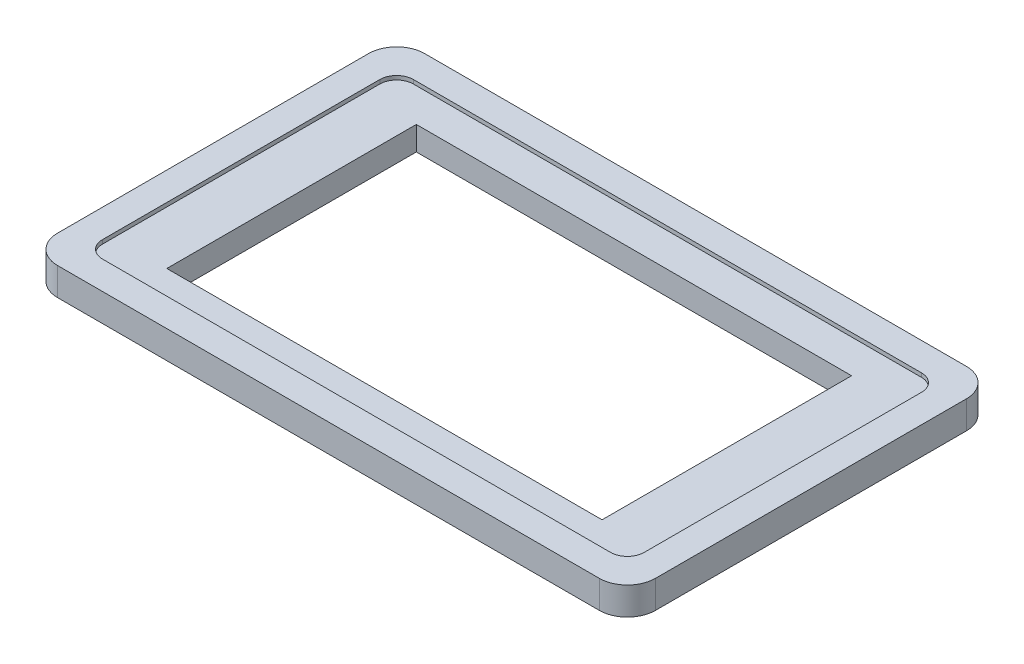
ISO-10303-21;
HEADER;
FILE_DESCRIPTION(('STEP AP214'),'2;1');
FILE_NAME('part.step','',(''),(''),'','','');
FILE_SCHEMA(('AUTOMOTIVE_DESIGN { 1 0 10303 214 1 1 1 1 }'));
ENDSEC;
DATA;
#1=APPLICATION_CONTEXT('core data for automotive mechanical design processes');
#2=APPLICATION_PROTOCOL_DEFINITION('international standard','automotive_design',2000,#1);
#3=PRODUCT_CONTEXT('',#1,'mechanical');
#4=PRODUCT('Part','Part','',(#3));
#5=PRODUCT_RELATED_PRODUCT_CATEGORY('part','',(#4));
#6=PRODUCT_DEFINITION_FORMATION('','',#4);
#7=PRODUCT_DEFINITION_CONTEXT('part definition',#1,'design');
#8=PRODUCT_DEFINITION('design','',#6,#7);
#9=PRODUCT_DEFINITION_SHAPE('','',#8);
#10=(LENGTH_UNIT() NAMED_UNIT(*) SI_UNIT(.MILLI.,.METRE.));
#11=(NAMED_UNIT(*) PLANE_ANGLE_UNIT() SI_UNIT($,.RADIAN.));
#12=(NAMED_UNIT(*) SI_UNIT($,.STERADIAN.) SOLID_ANGLE_UNIT());
#13=UNCERTAINTY_MEASURE_WITH_UNIT(LENGTH_MEASURE(1.E-05),#10,'distance_accuracy_value','');
#14=(GEOMETRIC_REPRESENTATION_CONTEXT(3) GLOBAL_UNCERTAINTY_ASSIGNED_CONTEXT((#13)) GLOBAL_UNIT_ASSIGNED_CONTEXT((#10,
#11,#12)) REPRESENTATION_CONTEXT('',''));
#15=CARTESIAN_POINT('',(0.,0.,0.));
#16=DIRECTION('',(0.,0.,1.));
#17=DIRECTION('',(1.,0.,0.));
#18=AXIS2_PLACEMENT_3D('',#15,#16,#17);
#19=CARTESIAN_POINT('',(10.,1.4,0.));
#20=DIRECTION('',(-1.,0.,0.));
#21=DIRECTION('',(0.,0.,1.));
#22=AXIS2_PLACEMENT_3D('',#19,#20,#21);
#23=PLANE('',#22);
#24=DIRECTION('',(0.,0.,-1.));
#25=VECTOR('',#24,1.);
#26=CARTESIAN_POINT('',(10.,0.,0.));
#27=LINE('',#26,#25);
#28=CARTESIAN_POINT('',(10.,0.,-16.));
#29=VERTEX_POINT('',#28);
#30=CARTESIAN_POINT('',(10.,0.,-114.76));
#31=VERTEX_POINT('',#30);
#32=EDGE_CURVE('E260',#29,#31,#27,.T.);
#33=ORIENTED_EDGE('',*,*,#32,.T.);
#34=DIRECTION('',(0.,-1.,0.));
#35=VECTOR('',#34,1.);
#36=CARTESIAN_POINT('',(10.,1.4,-114.76));
#37=LINE('',#36,#35);
#38=CARTESIAN_POINT('',(10.,1.4,-114.76));
#39=VERTEX_POINT('',#38);
#40=EDGE_CURVE('E11',#39,#31,#37,.T.);
#41=ORIENTED_EDGE('',*,*,#40,.F.);
#42=DIRECTION('',(0.,0.,-1.));
#43=VECTOR('',#42,1.);
#44=CARTESIAN_POINT('',(10.,1.4,0.));
#45=LINE('',#44,#43);
#46=CARTESIAN_POINT('',(10.,1.4,-16.));
#47=VERTEX_POINT('',#46);
#48=EDGE_CURVE('E296',#47,#39,#45,.T.);
#49=ORIENTED_EDGE('',*,*,#48,.F.);
#50=DIRECTION('',(0.,-1.,0.));
#51=VECTOR('',#50,1.);
#52=CARTESIAN_POINT('',(10.,1.4,-16.));
#53=LINE('',#52,#51);
#54=EDGE_CURVE('E350',#47,#29,#53,.T.);
#55=ORIENTED_EDGE('',*,*,#54,.T.);
#56=EDGE_LOOP('',(#33,#41,#49,#55));
#57=FACE_BOUND('',#56,.T.);
#58=ADVANCED_FACE('F41',(#57),#23,.F.);
#59=CARTESIAN_POINT('',(16.,1.4,-114.76));
#60=DIRECTION('',(0.,-1.,0.));
#61=DIRECTION('',(0.,0.,-1.));
#62=AXIS2_PLACEMENT_3D('',#59,#60,#61);
#63=CYLINDRICAL_SURFACE('',#62,6.);
#64=CARTESIAN_POINT('',(16.,0.,-114.76));
#65=DIRECTION('',(0.,1.,0.));
#66=DIRECTION('',(0.,0.,1.));
#67=AXIS2_PLACEMENT_3D('',#64,#65,#66);
#68=CIRCLE('',#67,6.);
#69=CARTESIAN_POINT('',(16.,0.,-120.76));
#70=VERTEX_POINT('',#69);
#71=EDGE_CURVE('E326',#31,#70,#68,.F.);
#72=ORIENTED_EDGE('',*,*,#71,.T.);
#73=DIRECTION('',(0.,-1.,0.));
#74=VECTOR('',#73,1.);
#75=CARTESIAN_POINT('',(16.,1.4,-120.76));
#76=LINE('',#75,#74);
#77=CARTESIAN_POINT('',(16.,1.4,-120.76));
#78=VERTEX_POINT('',#77);
#79=EDGE_CURVE('E52',#78,#70,#76,.T.);
#80=ORIENTED_EDGE('',*,*,#79,.F.);
#81=CARTESIAN_POINT('',(16.,1.4,-114.76));
#82=DIRECTION('',(0.,1.,0.));
#83=DIRECTION('',(0.,0.,1.));
#84=AXIS2_PLACEMENT_3D('',#81,#82,#83);
#85=CIRCLE('',#84,6.);
#86=EDGE_CURVE('E299',#39,#78,#85,.F.);
#87=ORIENTED_EDGE('',*,*,#86,.F.);
#88=ORIENTED_EDGE('',*,*,#40,.T.);
#89=EDGE_LOOP('',(#72,#80,#87,#88));
#90=FACE_BOUND('',#89,.T.);
#91=ADVANCED_FACE('F438',(#90),#63,.F.);
#92=CARTESIAN_POINT('',(0.,1.4,-120.76));
#93=DIRECTION('',(0.,0.,-1.));
#94=DIRECTION('',(-1.,0.,0.));
#95=AXIS2_PLACEMENT_3D('',#92,#93,#94);
#96=PLANE('',#95);
#97=DIRECTION('',(1.,0.,0.));
#98=VECTOR('',#97,1.);
#99=CARTESIAN_POINT('',(0.,0.,-120.76));
#100=LINE('',#99,#98);
#101=CARTESIAN_POINT('',(196.96,0.,-120.76));
#102=VERTEX_POINT('',#101);
#103=EDGE_CURVE('E330',#70,#102,#100,.T.);
#104=ORIENTED_EDGE('',*,*,#103,.T.);
#105=DIRECTION('',(0.,-1.,0.));
#106=VECTOR('',#105,1.);
#107=CARTESIAN_POINT('',(196.96,1.4,-120.76));
#108=LINE('',#107,#106);
#109=CARTESIAN_POINT('',(196.96,1.4,-120.76));
#110=VERTEX_POINT('',#109);
#111=EDGE_CURVE('E370',#110,#102,#108,.T.);
#112=ORIENTED_EDGE('',*,*,#111,.F.);
#113=DIRECTION('',(1.,0.,0.));
#114=VECTOR('',#113,1.);
#115=CARTESIAN_POINT('',(0.,1.4,-120.76));
#116=LINE('',#115,#114);
#117=EDGE_CURVE('E302',#78,#110,#116,.T.);
#118=ORIENTED_EDGE('',*,*,#117,.F.);
#119=ORIENTED_EDGE('',*,*,#79,.T.);
#120=EDGE_LOOP('',(#104,#112,#118,#119));
#121=FACE_BOUND('',#120,.T.);
#122=ADVANCED_FACE('F444',(#121),#96,.F.);
#123=CARTESIAN_POINT('',(196.96,1.4,-114.76));
#124=DIRECTION('',(0.,-1.,0.));
#125=DIRECTION('',(0.,0.,-1.));
#126=AXIS2_PLACEMENT_3D('',#123,#124,#125);
#127=CYLINDRICAL_SURFACE('',#126,6.00000000000001);
#128=CARTESIAN_POINT('',(196.96,0.,-114.76));
#129=DIRECTION('',(0.,1.,0.));
#130=DIRECTION('',(0.,0.,1.));
#131=AXIS2_PLACEMENT_3D('',#128,#129,#130);
#132=CIRCLE('',#131,6.00000000000001);
#133=CARTESIAN_POINT('',(202.96,0.,-114.76));
#134=VERTEX_POINT('',#133);
#135=EDGE_CURVE('E334',#102,#134,#132,.F.);
#136=ORIENTED_EDGE('',*,*,#135,.T.);
#137=DIRECTION('',(0.,-1.,0.));
#138=VECTOR('',#137,1.);
#139=CARTESIAN_POINT('',(202.96,1.4,-114.76));
#140=LINE('',#139,#138);
#141=CARTESIAN_POINT('',(202.96,1.4,-114.76));
#142=VERTEX_POINT('',#141);
#143=EDGE_CURVE('E366',#142,#134,#140,.T.);
#144=ORIENTED_EDGE('',*,*,#143,.F.);
#145=CARTESIAN_POINT('',(196.96,1.4,-114.76));
#146=DIRECTION('',(0.,1.,0.));
#147=DIRECTION('',(0.,0.,1.));
#148=AXIS2_PLACEMENT_3D('',#145,#146,#147);
#149=CIRCLE('',#148,6.00000000000001);
#150=EDGE_CURVE('E305',#110,#142,#149,.F.);
#151=ORIENTED_EDGE('',*,*,#150,.F.);
#152=ORIENTED_EDGE('',*,*,#111,.T.);
#153=EDGE_LOOP('',(#136,#144,#151,#152));
#154=FACE_BOUND('',#153,.T.);
#155=ADVANCED_FACE('F638',(#154),#127,.F.);
#156=CARTESIAN_POINT('',(202.96,1.4,0.));
#157=DIRECTION('',(-1.,0.,0.));
#158=DIRECTION('',(0.,0.,1.));
#159=AXIS2_PLACEMENT_3D('',#156,#157,#158);
#160=PLANE('',#159);
#161=DIRECTION('',(0.,0.,-1.));
#162=VECTOR('',#161,1.);
#163=CARTESIAN_POINT('',(202.96,0.,0.));
#164=LINE('',#163,#162);
#165=CARTESIAN_POINT('',(202.96,0.,-16.));
#166=VERTEX_POINT('',#165);
#167=EDGE_CURVE('E338',#166,#134,#164,.T.);
#168=ORIENTED_EDGE('',*,*,#167,.F.);
#169=DIRECTION('',(0.,-1.,0.));
#170=VECTOR('',#169,1.);
#171=CARTESIAN_POINT('',(202.96,1.4,-16.));
#172=LINE('',#171,#170);
#173=CARTESIAN_POINT('',(202.96,1.4,-16.));
#174=VERTEX_POINT('',#173);
#175=EDGE_CURVE('E362',#174,#166,#172,.T.);
#176=ORIENTED_EDGE('',*,*,#175,.F.);
#177=DIRECTION('',(0.,0.,-1.));
#178=VECTOR('',#177,1.);
#179=CARTESIAN_POINT('',(202.96,1.4,0.));
#180=LINE('',#179,#178);
#181=EDGE_CURVE('E308',#174,#142,#180,.T.);
#182=ORIENTED_EDGE('',*,*,#181,.T.);
#183=ORIENTED_EDGE('',*,*,#143,.T.);
#184=EDGE_LOOP('',(#168,#176,#182,#183));
#185=FACE_BOUND('',#184,.T.);
#186=ADVANCED_FACE('F628',(#185),#160,.T.);
#187=CARTESIAN_POINT('',(196.96,1.4,-16.));
#188=DIRECTION('',(0.,-1.,0.));
#189=DIRECTION('',(0.,0.,-1.));
#190=AXIS2_PLACEMENT_3D('',#187,#188,#189);
#191=CYLINDRICAL_SURFACE('',#190,6.);
#192=CARTESIAN_POINT('',(196.96,0.,-16.));
#193=DIRECTION('',(0.,1.,0.));
#194=DIRECTION('',(0.,0.,1.));
#195=AXIS2_PLACEMENT_3D('',#192,#193,#194);
#196=CIRCLE('',#195,6.);
#197=CARTESIAN_POINT('',(196.96,0.,-10.));
#198=VERTEX_POINT('',#197);
#199=EDGE_CURVE('E341',#198,#166,#196,.T.);
#200=ORIENTED_EDGE('',*,*,#199,.F.);
#201=DIRECTION('',(0.,-1.,0.));
#202=VECTOR('',#201,1.);
#203=CARTESIAN_POINT('',(196.96,1.4,-10.));
#204=LINE('',#203,#202);
#205=CARTESIAN_POINT('',(196.96,1.4,-10.));
#206=VERTEX_POINT('',#205);
#207=EDGE_CURVE('E358',#206,#198,#204,.T.);
#208=ORIENTED_EDGE('',*,*,#207,.F.);
#209=CARTESIAN_POINT('',(196.96,1.4,-16.));
#210=DIRECTION('',(0.,1.,0.));
#211=DIRECTION('',(0.,0.,1.));
#212=AXIS2_PLACEMENT_3D('',#209,#210,#211);
#213=CIRCLE('',#212,6.);
#214=EDGE_CURVE('E312',#206,#174,#213,.T.);
#215=ORIENTED_EDGE('',*,*,#214,.T.);
#216=ORIENTED_EDGE('',*,*,#175,.T.);
#217=EDGE_LOOP('',(#200,#208,#215,#216));
#218=FACE_BOUND('',#217,.T.);
#219=ADVANCED_FACE('F618',(#218),#191,.F.);
#220=CARTESIAN_POINT('',(0.,1.4,-10.));
#221=DIRECTION('',(0.,0.,-1.));
#222=DIRECTION('',(-1.,0.,0.));
#223=AXIS2_PLACEMENT_3D('',#220,#221,#222);
#224=PLANE('',#223);
#225=DIRECTION('',(1.,0.,0.));
#226=VECTOR('',#225,1.);
#227=CARTESIAN_POINT('',(0.,0.,-10.));
#228=LINE('',#227,#226);
#229=CARTESIAN_POINT('',(16.,0.,-10.));
#230=VERTEX_POINT('',#229);
#231=EDGE_CURVE('E344',#230,#198,#228,.T.);
#232=ORIENTED_EDGE('',*,*,#231,.F.);
#233=DIRECTION('',(0.,-1.,0.));
#234=VECTOR('',#233,1.);
#235=CARTESIAN_POINT('',(16.,1.4,-10.));
#236=LINE('',#235,#234);
#237=CARTESIAN_POINT('',(16.,1.4,-10.));
#238=VERTEX_POINT('',#237);
#239=EDGE_CURVE('E354',#238,#230,#236,.T.);
#240=ORIENTED_EDGE('',*,*,#239,.F.);
#241=DIRECTION('',(1.,0.,0.));
#242=VECTOR('',#241,1.);
#243=CARTESIAN_POINT('',(0.,1.4,-10.));
#244=LINE('',#243,#242);
#245=EDGE_CURVE('E316',#238,#206,#244,.T.);
#246=ORIENTED_EDGE('',*,*,#245,.T.);
#247=ORIENTED_EDGE('',*,*,#207,.T.);
#248=EDGE_LOOP('',(#232,#240,#246,#247));
#249=FACE_BOUND('',#248,.T.);
#250=ADVANCED_FACE('F604',(#249),#224,.T.);
#251=CARTESIAN_POINT('',(10.,1.4,-120.76));
#252=DIRECTION('',(0.,-1.,0.));
#253=DIRECTION('',(0.,0.,-1.));
#254=AXIS2_PLACEMENT_3D('',#251,#252,#253);
#255=CYLINDRICAL_SURFACE('',#254,10.);
#256=DIRECTION('',(0.,-1.,0.));
#257=VECTOR('',#256,1.);
#258=CARTESIAN_POINT('',(10.0000000000001,1.4,-130.76));
#259=LINE('',#258,#257);
#260=CARTESIAN_POINT('',(10.0000000000001,1.4,-130.76));
#261=VERTEX_POINT('',#260);
#262=CARTESIAN_POINT('',(10.0000000000001,-8.5,-130.76));
#263=VERTEX_POINT('',#262);
#264=EDGE_CURVE('E322',#261,#263,#259,.T.);
#265=ORIENTED_EDGE('',*,*,#264,.T.);
#266=CARTESIAN_POINT('',(10.,-8.5,-120.76));
#267=DIRECTION('',(0.,1.,0.));
#268=DIRECTION('',(0.,0.,1.));
#269=AXIS2_PLACEMENT_3D('',#266,#267,#268);
#270=CIRCLE('',#269,10.);
#271=CARTESIAN_POINT('',(0.,-8.5,-120.76));
#272=VERTEX_POINT('',#271);
#273=EDGE_CURVE('E220',#272,#263,#270,.F.);
#274=ORIENTED_EDGE('',*,*,#273,.F.);
#275=DIRECTION('',(0.,-1.,0.));
#276=VECTOR('',#275,1.);
#277=CARTESIAN_POINT('',(0.,1.4,-120.76));
#278=LINE('',#277,#276);
#279=CARTESIAN_POINT('',(0.,1.4,-120.76));
#280=VERTEX_POINT('',#279);
#281=EDGE_CURVE('E45',#280,#272,#278,.T.);
#282=ORIENTED_EDGE('',*,*,#281,.F.);
#283=CARTESIAN_POINT('',(10.,1.4,-120.76));
#284=DIRECTION('',(0.,1.,0.));
#285=DIRECTION('',(0.,0.,1.));
#286=AXIS2_PLACEMENT_3D('',#283,#284,#285);
#287=CIRCLE('',#286,10.);
#288=EDGE_CURVE('E266',#280,#261,#287,.F.);
#289=ORIENTED_EDGE('',*,*,#288,.T.);
#290=EDGE_LOOP('',(#265,#274,#282,#289));
#291=FACE_BOUND('',#290,.T.);
#292=ADVANCED_FACE('F43',(#291),#255,.T.);
#293=CARTESIAN_POINT('',(0.,1.4,0.));
#294=DIRECTION('',(-1.,0.,0.));
#295=DIRECTION('',(0.,0.,1.));
#296=AXIS2_PLACEMENT_3D('',#293,#294,#295);
#297=PLANE('',#296);
#298=ORIENTED_EDGE('',*,*,#281,.T.);
#299=DIRECTION('',(0.,0.,-1.));
#300=VECTOR('',#299,1.);
#301=CARTESIAN_POINT('',(0.,-8.5,0.));
#302=LINE('',#301,#300);
#303=CARTESIAN_POINT('',(0.,-8.5,-10.0000000000001));
#304=VERTEX_POINT('',#303);
#305=EDGE_CURVE('E224',#304,#272,#302,.T.);
#306=ORIENTED_EDGE('',*,*,#305,.F.);
#307=DIRECTION('',(0.,-1.,0.));
#308=VECTOR('',#307,1.);
#309=CARTESIAN_POINT('',(0.,1.4,-10.0000000000001));
#310=LINE('',#309,#308);
#311=CARTESIAN_POINT('',(0.,1.4,-10.0000000000001));
#312=VERTEX_POINT('',#311);
#313=EDGE_CURVE('E393',#312,#304,#310,.T.);
#314=ORIENTED_EDGE('',*,*,#313,.F.);
#315=DIRECTION('',(0.,0.,-1.));
#316=VECTOR('',#315,1.);
#317=CARTESIAN_POINT('',(0.,1.4,0.));
#318=LINE('',#317,#316);
#319=EDGE_CURVE('E270',#312,#280,#318,.T.);
#320=ORIENTED_EDGE('',*,*,#319,.T.);
#321=EDGE_LOOP('',(#298,#306,#314,#320));
#322=FACE_BOUND('',#321,.T.);
#323=ADVANCED_FACE('F400',(#322),#297,.T.);
#324=CARTESIAN_POINT('',(10.,1.4,-10.));
#325=DIRECTION('',(0.,-1.,0.));
#326=DIRECTION('',(0.,0.,-1.));
#327=AXIS2_PLACEMENT_3D('',#324,#325,#326);
#328=CYLINDRICAL_SURFACE('',#327,10.);
#329=ORIENTED_EDGE('',*,*,#313,.T.);
#330=CARTESIAN_POINT('',(10.,-8.5,-10.));
#331=DIRECTION('',(0.,1.,0.));
#332=DIRECTION('',(0.,0.,1.));
#333=AXIS2_PLACEMENT_3D('',#330,#331,#332);
#334=CIRCLE('',#333,10.);
#335=CARTESIAN_POINT('',(10.0000000000001,-8.5,0.));
#336=VERTEX_POINT('',#335);
#337=EDGE_CURVE('E228',#336,#304,#334,.F.);
#338=ORIENTED_EDGE('',*,*,#337,.F.);
#339=DIRECTION('',(0.,-1.,0.));
#340=VECTOR('',#339,1.);
#341=CARTESIAN_POINT('',(10.0000000000001,1.4,0.));
#342=LINE('',#341,#340);
#343=CARTESIAN_POINT('',(10.0000000000001,1.4,0.));
#344=VERTEX_POINT('',#343);
#345=EDGE_CURVE('E391',#344,#336,#342,.T.);
#346=ORIENTED_EDGE('',*,*,#345,.F.);
#347=CARTESIAN_POINT('',(10.,1.4,-10.));
#348=DIRECTION('',(0.,1.,0.));
#349=DIRECTION('',(0.,0.,1.));
#350=AXIS2_PLACEMENT_3D('',#347,#348,#349);
#351=CIRCLE('',#350,10.);
#352=EDGE_CURVE('E275',#344,#312,#351,.F.);
#353=ORIENTED_EDGE('',*,*,#352,.T.);
#354=EDGE_LOOP('',(#329,#338,#346,#353));
#355=FACE_BOUND('',#354,.T.);
#356=ADVANCED_FACE('F429',(#355),#328,.T.);
#357=CARTESIAN_POINT('',(0.,1.4,0.));
#358=DIRECTION('',(0.,0.,-1.));
#359=DIRECTION('',(-1.,0.,0.));
#360=AXIS2_PLACEMENT_3D('',#357,#358,#359);
#361=PLANE('',#360);
#362=ORIENTED_EDGE('',*,*,#345,.T.);
#363=DIRECTION('',(1.,0.,0.));
#364=VECTOR('',#363,1.);
#365=CARTESIAN_POINT('',(0.,-8.5,0.));
#366=LINE('',#365,#364);
#367=CARTESIAN_POINT('',(202.96,-8.5,0.));
#368=VERTEX_POINT('',#367);
#369=EDGE_CURVE('E232',#336,#368,#366,.T.);
#370=ORIENTED_EDGE('',*,*,#369,.T.);
#371=DIRECTION('',(0.,-1.,0.));
#372=VECTOR('',#371,1.);
#373=CARTESIAN_POINT('',(202.96,1.4,0.));
#374=LINE('',#373,#372);
#375=CARTESIAN_POINT('',(202.96,1.4,0.));
#376=VERTEX_POINT('',#375);
#377=EDGE_CURVE('E388',#376,#368,#374,.T.);
#378=ORIENTED_EDGE('',*,*,#377,.F.);
#379=DIRECTION('',(1.,0.,0.));
#380=VECTOR('',#379,1.);
#381=CARTESIAN_POINT('',(0.,1.4,0.));
#382=LINE('',#381,#380);
#383=EDGE_CURVE('E279',#344,#376,#382,.T.);
#384=ORIENTED_EDGE('',*,*,#383,.F.);
#385=EDGE_LOOP('',(#362,#370,#378,#384));
#386=FACE_BOUND('',#385,.T.);
#387=ADVANCED_FACE('F427',(#386),#361,.F.);
#388=CARTESIAN_POINT('',(202.96,1.4,-10.));
#389=DIRECTION('',(0.,-1.,0.));
#390=DIRECTION('',(0.,0.,-1.));
#391=AXIS2_PLACEMENT_3D('',#388,#389,#390);
#392=CYLINDRICAL_SURFACE('',#391,10.);
#393=ORIENTED_EDGE('',*,*,#377,.T.);
#394=CARTESIAN_POINT('',(202.96,-8.5,-10.));
#395=DIRECTION('',(0.,1.,0.));
#396=DIRECTION('',(0.,0.,1.));
#397=AXIS2_PLACEMENT_3D('',#394,#395,#396);
#398=CIRCLE('',#397,10.);
#399=CARTESIAN_POINT('',(212.96,-8.5,-10.0000000000001));
#400=VERTEX_POINT('',#399);
#401=EDGE_CURVE('E236',#368,#400,#398,.T.);
#402=ORIENTED_EDGE('',*,*,#401,.T.);
#403=DIRECTION('',(0.,-1.,0.));
#404=VECTOR('',#403,1.);
#405=CARTESIAN_POINT('',(212.96,1.4,-10.0000000000001));
#406=LINE('',#405,#404);
#407=CARTESIAN_POINT('',(212.96,1.4,-10.0000000000001));
#408=VERTEX_POINT('',#407);
#409=EDGE_CURVE('E385',#408,#400,#406,.T.);
#410=ORIENTED_EDGE('',*,*,#409,.F.);
#411=CARTESIAN_POINT('',(202.96,1.4,-10.));
#412=DIRECTION('',(0.,1.,0.));
#413=DIRECTION('',(0.,0.,1.));
#414=AXIS2_PLACEMENT_3D('',#411,#412,#413);
#415=CIRCLE('',#414,10.);
#416=EDGE_CURVE('E282',#376,#408,#415,.T.);
#417=ORIENTED_EDGE('',*,*,#416,.F.);
#418=EDGE_LOOP('',(#393,#402,#410,#417));
#419=FACE_BOUND('',#418,.T.);
#420=ADVANCED_FACE('F422',(#419),#392,.T.);
#421=CARTESIAN_POINT('',(212.96,1.4,0.));
#422=DIRECTION('',(-1.,0.,0.));
#423=DIRECTION('',(0.,0.,1.));
#424=AXIS2_PLACEMENT_3D('',#421,#422,#423);
#425=PLANE('',#424);
#426=ORIENTED_EDGE('',*,*,#409,.T.);
#427=DIRECTION('',(0.,0.,-1.));
#428=VECTOR('',#427,1.);
#429=CARTESIAN_POINT('',(212.96,-8.5,0.));
#430=LINE('',#429,#428);
#431=CARTESIAN_POINT('',(212.96,-8.5,-120.76));
#432=VERTEX_POINT('',#431);
#433=EDGE_CURVE('E240',#400,#432,#430,.T.);
#434=ORIENTED_EDGE('',*,*,#433,.T.);
#435=DIRECTION('',(0.,-1.,0.));
#436=VECTOR('',#435,1.);
#437=CARTESIAN_POINT('',(212.96,1.4,-120.76));
#438=LINE('',#437,#436);
#439=CARTESIAN_POINT('',(212.96,1.4,-120.76));
#440=VERTEX_POINT('',#439);
#441=EDGE_CURVE('E382',#440,#432,#438,.T.);
#442=ORIENTED_EDGE('',*,*,#441,.F.);
#443=DIRECTION('',(0.,0.,-1.));
#444=VECTOR('',#443,1.);
#445=CARTESIAN_POINT('',(212.96,1.4,0.));
#446=LINE('',#445,#444);
#447=EDGE_CURVE('E285',#408,#440,#446,.T.);
#448=ORIENTED_EDGE('',*,*,#447,.F.);
#449=EDGE_LOOP('',(#426,#434,#442,#448));
#450=FACE_BOUND('',#449,.T.);
#451=ADVANCED_FACE('F418',(#450),#425,.F.);
#452=CARTESIAN_POINT('',(202.96,1.4,-120.76));
#453=DIRECTION('',(0.,-1.,0.));
#454=DIRECTION('',(0.,0.,-1.));
#455=AXIS2_PLACEMENT_3D('',#452,#453,#454);
#456=CYLINDRICAL_SURFACE('',#455,10.);
#457=ORIENTED_EDGE('',*,*,#441,.T.);
#458=CARTESIAN_POINT('',(202.96,-8.5,-120.76));
#459=DIRECTION('',(0.,1.,0.));
#460=DIRECTION('',(0.,0.,1.));
#461=AXIS2_PLACEMENT_3D('',#458,#459,#460);
#462=CIRCLE('',#461,10.);
#463=CARTESIAN_POINT('',(202.96,-8.5,-130.76));
#464=VERTEX_POINT('',#463);
#465=EDGE_CURVE('E244',#464,#432,#462,.F.);
#466=ORIENTED_EDGE('',*,*,#465,.F.);
#467=DIRECTION('',(0.,-1.,0.));
#468=VECTOR('',#467,1.);
#469=CARTESIAN_POINT('',(202.96,1.4,-130.76));
#470=LINE('',#469,#468);
#471=CARTESIAN_POINT('',(202.96,1.4,-130.76));
#472=VERTEX_POINT('',#471);
#473=EDGE_CURVE('E379',#472,#464,#470,.T.);
#474=ORIENTED_EDGE('',*,*,#473,.F.);
#475=CARTESIAN_POINT('',(202.96,1.4,-120.76));
#476=DIRECTION('',(0.,1.,0.));
#477=DIRECTION('',(0.,0.,1.));
#478=AXIS2_PLACEMENT_3D('',#475,#476,#477);
#479=CIRCLE('',#478,10.);
#480=EDGE_CURVE('E288',#472,#440,#479,.F.);
#481=ORIENTED_EDGE('',*,*,#480,.T.);
#482=EDGE_LOOP('',(#457,#466,#474,#481));
#483=FACE_BOUND('',#482,.T.);
#484=ADVANCED_FACE('F413',(#483),#456,.T.);
#485=CARTESIAN_POINT('',(0.,1.4,-130.76));
#486=DIRECTION('',(0.,0.,-1.));
#487=DIRECTION('',(-1.,0.,0.));
#488=AXIS2_PLACEMENT_3D('',#485,#486,#487);
#489=PLANE('',#488);
#490=ORIENTED_EDGE('',*,*,#473,.T.);
#491=DIRECTION('',(1.,0.,0.));
#492=VECTOR('',#491,1.);
#493=CARTESIAN_POINT('',(0.,-8.5,-130.76));
#494=LINE('',#493,#492);
#495=EDGE_CURVE('E203',#263,#464,#494,.T.);
#496=ORIENTED_EDGE('',*,*,#495,.F.);
#497=ORIENTED_EDGE('',*,*,#264,.F.);
#498=DIRECTION('',(1.,0.,0.));
#499=VECTOR('',#498,1.);
#500=CARTESIAN_POINT('',(0.,1.4,-130.76));
#501=LINE('',#500,#499);
#502=EDGE_CURVE('E292',#261,#472,#501,.T.);
#503=ORIENTED_EDGE('',*,*,#502,.T.);
#504=EDGE_LOOP('',(#490,#496,#497,#503));
#505=FACE_BOUND('',#504,.T.);
#506=ADVANCED_FACE('F409',(#505),#489,.T.);
#507=CARTESIAN_POINT('',(16.,1.4,-16.));
#508=DIRECTION('',(0.,-1.,0.));
#509=DIRECTION('',(0.,0.,-1.));
#510=AXIS2_PLACEMENT_3D('',#507,#508,#509);
#511=CYLINDRICAL_SURFACE('',#510,6.);
#512=CARTESIAN_POINT('',(16.,0.,-16.));
#513=DIRECTION('',(0.,1.,0.));
#514=DIRECTION('',(0.,0.,1.));
#515=AXIS2_PLACEMENT_3D('',#512,#513,#514);
#516=CIRCLE('',#515,6.);
#517=EDGE_CURVE('E271',#230,#29,#516,.F.);
#518=ORIENTED_EDGE('',*,*,#517,.T.);
#519=ORIENTED_EDGE('',*,*,#54,.F.);
#520=CARTESIAN_POINT('',(16.,1.4,-16.));
#521=DIRECTION('',(0.,1.,0.));
#522=DIRECTION('',(0.,0.,1.));
#523=AXIS2_PLACEMENT_3D('',#520,#521,#522);
#524=CIRCLE('',#523,6.);
#525=EDGE_CURVE('E60',#238,#47,#524,.F.);
#526=ORIENTED_EDGE('',*,*,#525,.F.);
#527=ORIENTED_EDGE('',*,*,#239,.T.);
#528=EDGE_LOOP('',(#518,#519,#526,#527));
#529=FACE_BOUND('',#528,.T.);
#530=ADVANCED_FACE('F451',(#529),#511,.F.);
#531=CARTESIAN_POINT('',(0.,1.4,0.));
#532=DIRECTION('',(0.,1.,0.));
#533=DIRECTION('',(0.,0.,1.));
#534=AXIS2_PLACEMENT_3D('',#531,#532,#533);
#535=PLANE('',#534);
#536=ORIENTED_EDGE('',*,*,#288,.F.);
#537=ORIENTED_EDGE('',*,*,#319,.F.);
#538=ORIENTED_EDGE('',*,*,#352,.F.);
#539=ORIENTED_EDGE('',*,*,#383,.T.);
#540=ORIENTED_EDGE('',*,*,#416,.T.);
#541=ORIENTED_EDGE('',*,*,#447,.T.);
#542=ORIENTED_EDGE('',*,*,#480,.F.);
#543=ORIENTED_EDGE('',*,*,#502,.F.);
#544=EDGE_LOOP('',(#536,#537,#538,#539,#540,#541,#542,#543));
#545=FACE_BOUND('',#544,.T.);
#546=ORIENTED_EDGE('',*,*,#48,.T.);
#547=ORIENTED_EDGE('',*,*,#86,.T.);
#548=ORIENTED_EDGE('',*,*,#117,.T.);
#549=ORIENTED_EDGE('',*,*,#150,.T.);
#550=ORIENTED_EDGE('',*,*,#181,.F.);
#551=ORIENTED_EDGE('',*,*,#214,.F.);
#552=ORIENTED_EDGE('',*,*,#245,.F.);
#553=ORIENTED_EDGE('',*,*,#525,.T.);
#554=EDGE_LOOP('',(#546,#547,#548,#549,#550,#551,#552,#553));
#555=FACE_BOUND('',#554,.T.);
#556=ADVANCED_FACE('F479',(#545,#555),#535,.T.);
#557=CARTESIAN_POINT('',(0.,0.,0.));
#558=DIRECTION('',(0.,1.,0.));
#559=DIRECTION('',(0.,0.,1.));
#560=AXIS2_PLACEMENT_3D('',#557,#558,#559);
#561=PLANE('',#560);
#562=DIRECTION('',(0.,0.,1.));
#563=VECTOR('',#562,1.);
#564=CARTESIAN_POINT('',(183.995,0.,0.));
#565=LINE('',#564,#563);
#566=CARTESIAN_POINT('',(183.995,0.,-108.815));
#567=VERTEX_POINT('',#566);
#568=CARTESIAN_POINT('',(183.995,0.,-19.9450000000001));
#569=VERTEX_POINT('',#568);
#570=EDGE_CURVE('E251',#567,#569,#565,.T.);
#571=ORIENTED_EDGE('',*,*,#570,.T.);
#572=DIRECTION('',(1.,0.,0.));
#573=VECTOR('',#572,1.);
#574=CARTESIAN_POINT('',(0.,0.,-19.945));
#575=LINE('',#574,#573);
#576=CARTESIAN_POINT('',(28.965,0.,-19.945));
#577=VERTEX_POINT('',#576);
#578=EDGE_CURVE('E197',#577,#569,#575,.T.);
#579=ORIENTED_EDGE('',*,*,#578,.F.);
#580=DIRECTION('',(0.,0.,1.));
#581=VECTOR('',#580,1.);
#582=CARTESIAN_POINT('',(28.965,0.,0.));
#583=LINE('',#582,#581);
#584=CARTESIAN_POINT('',(28.965,0.,-108.815));
#585=VERTEX_POINT('',#584);
#586=EDGE_CURVE('E212',#585,#577,#583,.T.);
#587=ORIENTED_EDGE('',*,*,#586,.F.);
#588=DIRECTION('',(1.,0.,0.));
#589=VECTOR('',#588,1.);
#590=CARTESIAN_POINT('',(0.,0.,-108.815));
#591=LINE('',#590,#589);
#592=EDGE_CURVE('E208',#585,#567,#591,.T.);
#593=ORIENTED_EDGE('',*,*,#592,.T.);
#594=EDGE_LOOP('',(#571,#579,#587,#593));
#595=FACE_BOUND('',#594,.T.);
#596=ORIENTED_EDGE('',*,*,#32,.F.);
#597=ORIENTED_EDGE('',*,*,#517,.F.);
#598=ORIENTED_EDGE('',*,*,#231,.T.);
#599=ORIENTED_EDGE('',*,*,#199,.T.);
#600=ORIENTED_EDGE('',*,*,#167,.T.);
#601=ORIENTED_EDGE('',*,*,#135,.F.);
#602=ORIENTED_EDGE('',*,*,#103,.F.);
#603=ORIENTED_EDGE('',*,*,#71,.F.);
#604=EDGE_LOOP('',(#596,#597,#598,#599,#600,#601,#602,#603));
#605=FACE_BOUND('',#604,.T.);
#606=ADVANCED_FACE('F488',(#595,#605),#561,.T.);
#607=CARTESIAN_POINT('',(183.995,-8.5,0.));
#608=DIRECTION('',(-1.,0.,0.));
#609=DIRECTION('',(0.,0.,1.));
#610=AXIS2_PLACEMENT_3D('',#607,#608,#609);
#611=PLANE('',#610);
#612=ORIENTED_EDGE('',*,*,#570,.F.);
#613=DIRECTION('',(0.,1.,0.));
#614=VECTOR('',#613,1.);
#615=CARTESIAN_POINT('',(183.995,-8.5,-108.815));
#616=LINE('',#615,#614);
#617=CARTESIAN_POINT('',(183.995,-8.5,-108.815));
#618=VERTEX_POINT('',#617);
#619=EDGE_CURVE('E206',#618,#567,#616,.T.);
#620=ORIENTED_EDGE('',*,*,#619,.F.);
#621=DIRECTION('',(0.,0.,1.));
#622=VECTOR('',#621,1.);
#623=CARTESIAN_POINT('',(183.995,-8.5,0.));
#624=LINE('',#623,#622);
#625=CARTESIAN_POINT('',(183.995,-8.5,-19.9450000000001));
#626=VERTEX_POINT('',#625);
#627=EDGE_CURVE('E184',#618,#626,#624,.T.);
#628=ORIENTED_EDGE('',*,*,#627,.T.);
#629=DIRECTION('',(0.,1.,0.));
#630=VECTOR('',#629,1.);
#631=CARTESIAN_POINT('',(183.995,-8.5,-19.9450000000001));
#632=LINE('',#631,#630);
#633=EDGE_CURVE('E194',#626,#569,#632,.T.);
#634=ORIENTED_EDGE('',*,*,#633,.T.);
#635=EDGE_LOOP('',(#612,#620,#628,#634));
#636=FACE_BOUND('',#635,.T.);
#637=ADVANCED_FACE('F205',(#636),#611,.T.);
#638=CARTESIAN_POINT('',(0.,-8.5,-108.815));
#639=DIRECTION('',(0.,0.,1.));
#640=DIRECTION('',(1.,0.,0.));
#641=AXIS2_PLACEMENT_3D('',#638,#639,#640);
#642=PLANE('',#641);
#643=ORIENTED_EDGE('',*,*,#592,.F.);
#644=DIRECTION('',(0.,1.,0.));
#645=VECTOR('',#644,1.);
#646=CARTESIAN_POINT('',(28.965,-8.5,-108.815));
#647=LINE('',#646,#645);
#648=CARTESIAN_POINT('',(28.965,-8.5,-108.815));
#649=VERTEX_POINT('',#648);
#650=EDGE_CURVE('E261',#649,#585,#647,.T.);
#651=ORIENTED_EDGE('',*,*,#650,.F.);
#652=DIRECTION('',(1.,0.,0.));
#653=VECTOR('',#652,1.);
#654=CARTESIAN_POINT('',(0.,-8.5,-108.815));
#655=LINE('',#654,#653);
#656=EDGE_CURVE('E217',#649,#618,#655,.T.);
#657=ORIENTED_EDGE('',*,*,#656,.T.);
#658=ORIENTED_EDGE('',*,*,#619,.T.);
#659=EDGE_LOOP('',(#643,#651,#657,#658));
#660=FACE_BOUND('',#659,.T.);
#661=ADVANCED_FACE('F502',(#660),#642,.T.);
#662=CARTESIAN_POINT('',(28.965,-8.5,0.));
#663=DIRECTION('',(-1.,0.,0.));
#664=DIRECTION('',(0.,0.,1.));
#665=AXIS2_PLACEMENT_3D('',#662,#663,#664);
#666=PLANE('',#665);
#667=ORIENTED_EDGE('',*,*,#586,.T.);
#668=DIRECTION('',(0.,1.,0.));
#669=VECTOR('',#668,1.);
#670=CARTESIAN_POINT('',(28.965,-8.5,-19.945));
#671=LINE('',#670,#669);
#672=CARTESIAN_POINT('',(28.965,-8.5,-19.945));
#673=VERTEX_POINT('',#672);
#674=EDGE_CURVE('E202',#673,#577,#671,.T.);
#675=ORIENTED_EDGE('',*,*,#674,.F.);
#676=DIRECTION('',(0.,0.,1.));
#677=VECTOR('',#676,1.);
#678=CARTESIAN_POINT('',(28.965,-8.5,0.));
#679=LINE('',#678,#677);
#680=EDGE_CURVE('E187',#649,#673,#679,.T.);
#681=ORIENTED_EDGE('',*,*,#680,.F.);
#682=ORIENTED_EDGE('',*,*,#650,.T.);
#683=EDGE_LOOP('',(#667,#675,#681,#682));
#684=FACE_BOUND('',#683,.T.);
#685=ADVANCED_FACE('F509',(#684),#666,.F.);
#686=CARTESIAN_POINT('',(0.,-8.5,-19.945));
#687=DIRECTION('',(0.,0.,1.));
#688=DIRECTION('',(1.,0.,0.));
#689=AXIS2_PLACEMENT_3D('',#686,#687,#688);
#690=PLANE('',#689);
#691=ORIENTED_EDGE('',*,*,#578,.T.);
#692=ORIENTED_EDGE('',*,*,#633,.F.);
#693=DIRECTION('',(1.,0.,0.));
#694=VECTOR('',#693,1.);
#695=CARTESIAN_POINT('',(0.,-8.5,-19.945));
#696=LINE('',#695,#694);
#697=EDGE_CURVE('E178',#673,#626,#696,.T.);
#698=ORIENTED_EDGE('',*,*,#697,.F.);
#699=ORIENTED_EDGE('',*,*,#674,.T.);
#700=EDGE_LOOP('',(#691,#692,#698,#699));
#701=FACE_BOUND('',#700,.T.);
#702=ADVANCED_FACE('F195',(#701),#690,.F.);
#703=CARTESIAN_POINT('',(0.,-8.5,0.));
#704=DIRECTION('',(0.,1.,0.));
#705=DIRECTION('',(0.,0.,1.));
#706=AXIS2_PLACEMENT_3D('',#703,#704,#705);
#707=PLANE('',#706);
#708=ORIENTED_EDGE('',*,*,#627,.F.);
#709=ORIENTED_EDGE('',*,*,#656,.F.);
#710=ORIENTED_EDGE('',*,*,#680,.T.);
#711=ORIENTED_EDGE('',*,*,#697,.T.);
#712=EDGE_LOOP('',(#708,#709,#710,#711));
#713=FACE_BOUND('',#712,.T.);
#714=ORIENTED_EDGE('',*,*,#273,.T.);
#715=ORIENTED_EDGE('',*,*,#495,.T.);
#716=ORIENTED_EDGE('',*,*,#465,.T.);
#717=ORIENTED_EDGE('',*,*,#433,.F.);
#718=ORIENTED_EDGE('',*,*,#401,.F.);
#719=ORIENTED_EDGE('',*,*,#369,.F.);
#720=ORIENTED_EDGE('',*,*,#337,.T.);
#721=ORIENTED_EDGE('',*,*,#305,.T.);
#722=EDGE_LOOP('',(#714,#715,#716,#717,#718,#719,#720,#721));
#723=FACE_BOUND('',#722,.T.);
#724=ADVANCED_FACE('F180',(#713,#723),#707,.F.);
#725=CLOSED_SHELL('',(#58,#91,#122,#155,#186,#219,#250,#292,#323,#356,#387,#420,#451,#484,#506,
#530,#556,#606,#637,#661,#685,#702,#724));
#726=MANIFOLD_SOLID_BREP('B2',#725);
#727=ADVANCED_BREP_SHAPE_REPRESENTATION('',(#18,#726),#14);
#728=SHAPE_DEFINITION_REPRESENTATION(#9,#727);
ENDSEC;
END-ISO-10303-21;
